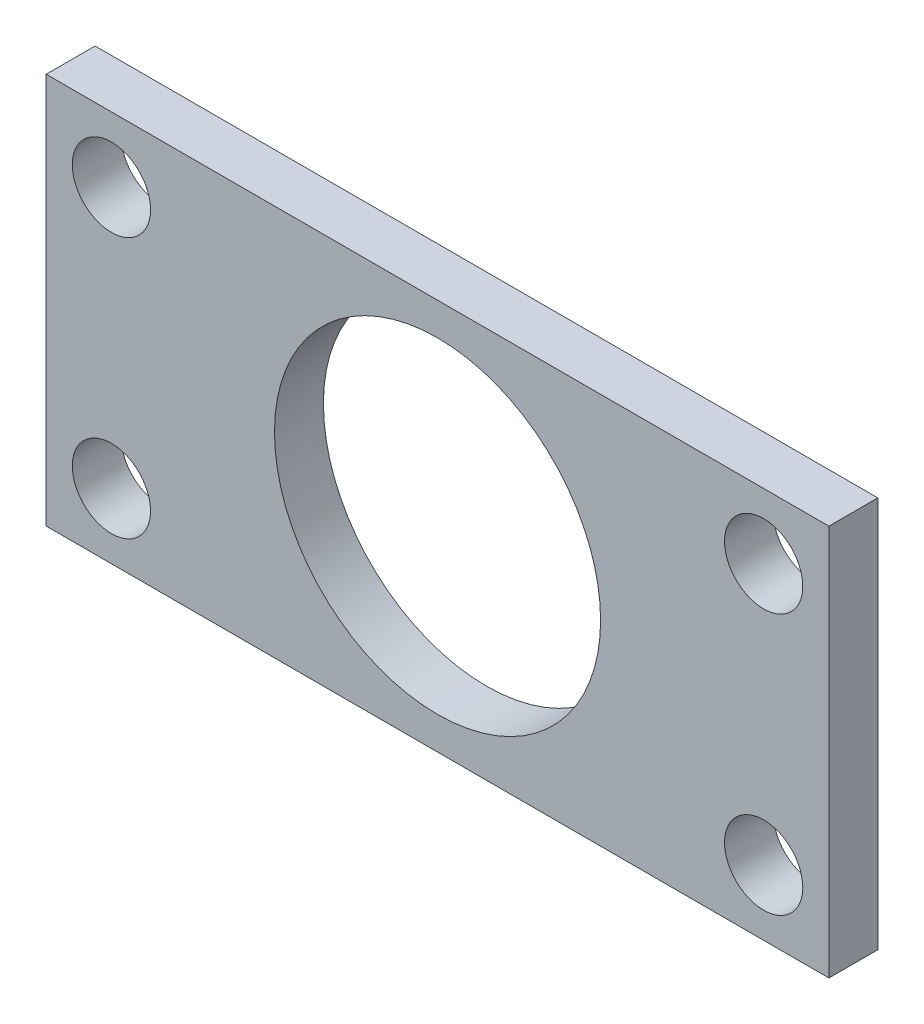
ISO-10303-21;
HEADER;
FILE_DESCRIPTION(('STEP AP214'),'2;1');
FILE_NAME('part.step','',(''),(''),'','','');
FILE_SCHEMA(('AUTOMOTIVE_DESIGN { 1 0 10303 214 1 1 1 1 }'));
ENDSEC;
DATA;
#1=APPLICATION_CONTEXT('core data for automotive mechanical design processes');
#2=APPLICATION_PROTOCOL_DEFINITION('international standard','automotive_design',2000,#1);
#3=PRODUCT_CONTEXT('',#1,'mechanical');
#4=PRODUCT('Part','Part','',(#3));
#5=PRODUCT_RELATED_PRODUCT_CATEGORY('part','',(#4));
#6=PRODUCT_DEFINITION_FORMATION('','',#4);
#7=PRODUCT_DEFINITION_CONTEXT('part definition',#1,'design');
#8=PRODUCT_DEFINITION('design','',#6,#7);
#9=PRODUCT_DEFINITION_SHAPE('','',#8);
#10=(LENGTH_UNIT() NAMED_UNIT(*) SI_UNIT(.MILLI.,.METRE.));
#11=(NAMED_UNIT(*) PLANE_ANGLE_UNIT() SI_UNIT($,.RADIAN.));
#12=(NAMED_UNIT(*) SI_UNIT($,.STERADIAN.) SOLID_ANGLE_UNIT());
#13=UNCERTAINTY_MEASURE_WITH_UNIT(LENGTH_MEASURE(1.E-05),#10,'distance_accuracy_value','');
#14=(GEOMETRIC_REPRESENTATION_CONTEXT(3) GLOBAL_UNCERTAINTY_ASSIGNED_CONTEXT((#13)) GLOBAL_UNIT_ASSIGNED_CONTEXT((#10,
#11,#12)) REPRESENTATION_CONTEXT('',''));
#15=CARTESIAN_POINT('',(0.,0.,0.));
#16=DIRECTION('',(0.,0.,1.));
#17=DIRECTION('',(1.,0.,0.));
#18=AXIS2_PLACEMENT_3D('',#15,#16,#17);
#19=CARTESIAN_POINT('',(0.,0.,1.5));
#20=DIRECTION('',(0.,0.,-1.));
#21=DIRECTION('',(-1.,0.,0.));
#22=AXIS2_PLACEMENT_3D('',#19,#20,#21);
#23=PLANE('',#22);
#24=DIRECTION('',(0.,-1.,0.));
#25=VECTOR('',#24,1.);
#26=CARTESIAN_POINT('',(0.,0.,1.5));
#27=LINE('',#26,#25);
#28=CARTESIAN_POINT('',(0.,12.,1.5));
#29=VERTEX_POINT('',#28);
#30=CARTESIAN_POINT('',(0.,0.,1.5));
#31=VERTEX_POINT('',#30);
#32=EDGE_CURVE('E89',#29,#31,#27,.T.);
#33=ORIENTED_EDGE('',*,*,#32,.T.);
#34=DIRECTION('',(1.,0.,0.));
#35=VECTOR('',#34,1.);
#36=CARTESIAN_POINT('',(0.,0.,1.5));
#37=LINE('',#36,#35);
#38=CARTESIAN_POINT('',(24.,0.,1.5));
#39=VERTEX_POINT('',#38);
#40=EDGE_CURVE('E84',#31,#39,#37,.T.);
#41=ORIENTED_EDGE('',*,*,#40,.T.);
#42=DIRECTION('',(0.,1.,0.));
#43=VECTOR('',#42,1.);
#44=CARTESIAN_POINT('',(24.,0.,1.5));
#45=LINE('',#44,#43);
#46=CARTESIAN_POINT('',(24.,12.,1.5));
#47=VERTEX_POINT('',#46);
#48=EDGE_CURVE('E87',#39,#47,#45,.T.);
#49=ORIENTED_EDGE('',*,*,#48,.T.);
#50=DIRECTION('',(-1.,0.,0.));
#51=VECTOR('',#50,1.);
#52=CARTESIAN_POINT('',(0.,12.,1.5));
#53=LINE('',#52,#51);
#54=EDGE_CURVE('E54',#47,#29,#53,.T.);
#55=ORIENTED_EDGE('',*,*,#54,.T.);
#56=EDGE_LOOP('',(#33,#41,#49,#55));
#57=FACE_BOUND('',#56,.T.);
#58=CARTESIAN_POINT('',(2.,10.,1.5));
#59=DIRECTION('',(0.,0.,1.));
#60=DIRECTION('',(1.,0.,0.));
#61=AXIS2_PLACEMENT_3D('',#58,#59,#60);
#62=CIRCLE('',#61,1.2);
#63=CARTESIAN_POINT('',(3.2,10.,1.5));
#64=VERTEX_POINT('',#63);
#65=EDGE_CURVE('E104',#64,#64,#62,.T.);
#66=ORIENTED_EDGE('',*,*,#65,.F.);
#67=EDGE_LOOP('',(#66));
#68=FACE_BOUND('',#67,.T.);
#69=CARTESIAN_POINT('',(22.,10.,1.5));
#70=DIRECTION('',(0.,0.,1.));
#71=DIRECTION('',(-1.,0.,0.));
#72=AXIS2_PLACEMENT_3D('',#69,#70,#71);
#73=CIRCLE('',#72,1.2);
#74=CARTESIAN_POINT('',(20.8,10.,1.5));
#75=VERTEX_POINT('',#74);
#76=EDGE_CURVE('E119',#75,#75,#73,.T.);
#77=ORIENTED_EDGE('',*,*,#76,.F.);
#78=EDGE_LOOP('',(#77));
#79=FACE_BOUND('',#78,.T.);
#80=CARTESIAN_POINT('',(22.,2.,1.5));
#81=DIRECTION('',(0.,0.,1.));
#82=DIRECTION('',(1.,0.,0.));
#83=AXIS2_PLACEMENT_3D('',#80,#81,#82);
#84=CIRCLE('',#83,1.2);
#85=CARTESIAN_POINT('',(23.2,2.,1.5));
#86=VERTEX_POINT('',#85);
#87=EDGE_CURVE('E125',#86,#86,#84,.T.);
#88=ORIENTED_EDGE('',*,*,#87,.F.);
#89=EDGE_LOOP('',(#88));
#90=FACE_BOUND('',#89,.T.);
#91=CARTESIAN_POINT('',(2.,2.,1.5));
#92=DIRECTION('',(0.,0.,1.));
#93=DIRECTION('',(-1.,0.,0.));
#94=AXIS2_PLACEMENT_3D('',#91,#92,#93);
#95=CIRCLE('',#94,1.2);
#96=CARTESIAN_POINT('',(0.800000000000001,2.,1.5));
#97=VERTEX_POINT('',#96);
#98=EDGE_CURVE('E131',#97,#97,#95,.T.);
#99=ORIENTED_EDGE('',*,*,#98,.F.);
#100=EDGE_LOOP('',(#99));
#101=FACE_BOUND('',#100,.T.);
#102=CARTESIAN_POINT('',(12.,6.,1.5));
#103=DIRECTION('',(0.,0.,1.));
#104=DIRECTION('',(1.,0.,0.));
#105=AXIS2_PLACEMENT_3D('',#102,#103,#104);
#106=CIRCLE('',#105,5.);
#107=CARTESIAN_POINT('',(17.,6.,1.5));
#108=VERTEX_POINT('',#107);
#109=EDGE_CURVE('E137',#108,#108,#106,.T.);
#110=ORIENTED_EDGE('',*,*,#109,.F.);
#111=EDGE_LOOP('',(#110));
#112=FACE_BOUND('',#111,.T.);
#113=ADVANCED_FACE('F37',(#57,#68,#79,#90,#101,#112),#23,.F.);
#114=CARTESIAN_POINT('',(0.,0.,0.));
#115=DIRECTION('',(0.,0.,-1.));
#116=DIRECTION('',(-1.,0.,0.));
#117=AXIS2_PLACEMENT_3D('',#114,#115,#116);
#118=PLANE('',#117);
#119=CARTESIAN_POINT('',(2.,2.,0.));
#120=DIRECTION('',(0.,0.,1.));
#121=DIRECTION('',(-1.,0.,0.));
#122=AXIS2_PLACEMENT_3D('',#119,#120,#121);
#123=CIRCLE('',#122,1.2);
#124=CARTESIAN_POINT('',(0.800000000000001,2.,0.));
#125=VERTEX_POINT('',#124);
#126=EDGE_CURVE('E134',#125,#125,#123,.T.);
#127=ORIENTED_EDGE('',*,*,#126,.T.);
#128=EDGE_LOOP('',(#127));
#129=FACE_BOUND('',#128,.T.);
#130=CARTESIAN_POINT('',(22.,10.,0.));
#131=DIRECTION('',(0.,0.,1.));
#132=DIRECTION('',(-1.,0.,0.));
#133=AXIS2_PLACEMENT_3D('',#130,#131,#132);
#134=CIRCLE('',#133,1.2);
#135=CARTESIAN_POINT('',(20.8,10.,0.));
#136=VERTEX_POINT('',#135);
#137=EDGE_CURVE('E122',#136,#136,#134,.T.);
#138=ORIENTED_EDGE('',*,*,#137,.T.);
#139=EDGE_LOOP('',(#138));
#140=FACE_BOUND('',#139,.T.);
#141=DIRECTION('',(0.,-1.,0.));
#142=VECTOR('',#141,1.);
#143=CARTESIAN_POINT('',(0.,0.,0.));
#144=LINE('',#143,#142);
#145=CARTESIAN_POINT('',(0.,12.,0.));
#146=VERTEX_POINT('',#145);
#147=CARTESIAN_POINT('',(0.,0.,0.));
#148=VERTEX_POINT('',#147);
#149=EDGE_CURVE('E101',#146,#148,#144,.T.);
#150=ORIENTED_EDGE('',*,*,#149,.F.);
#151=DIRECTION('',(-1.,0.,0.));
#152=VECTOR('',#151,1.);
#153=CARTESIAN_POINT('',(0.,12.,0.));
#154=LINE('',#153,#152);
#155=CARTESIAN_POINT('',(24.,12.,0.));
#156=VERTEX_POINT('',#155);
#157=EDGE_CURVE('E77',#156,#146,#154,.T.);
#158=ORIENTED_EDGE('',*,*,#157,.F.);
#159=DIRECTION('',(0.,1.,0.));
#160=VECTOR('',#159,1.);
#161=CARTESIAN_POINT('',(24.,0.,0.));
#162=LINE('',#161,#160);
#163=CARTESIAN_POINT('',(24.,0.,0.));
#164=VERTEX_POINT('',#163);
#165=EDGE_CURVE('E71',#164,#156,#162,.T.);
#166=ORIENTED_EDGE('',*,*,#165,.F.);
#167=DIRECTION('',(1.,0.,0.));
#168=VECTOR('',#167,1.);
#169=CARTESIAN_POINT('',(0.,0.,0.));
#170=LINE('',#169,#168);
#171=EDGE_CURVE('E93',#148,#164,#170,.T.);
#172=ORIENTED_EDGE('',*,*,#171,.F.);
#173=EDGE_LOOP('',(#150,#158,#166,#172));
#174=FACE_BOUND('',#173,.T.);
#175=CARTESIAN_POINT('',(2.,10.,0.));
#176=DIRECTION('',(0.,0.,1.));
#177=DIRECTION('',(1.,0.,0.));
#178=AXIS2_PLACEMENT_3D('',#175,#176,#177);
#179=CIRCLE('',#178,1.2);
#180=CARTESIAN_POINT('',(3.2,10.,0.));
#181=VERTEX_POINT('',#180);
#182=EDGE_CURVE('E116',#181,#181,#179,.T.);
#183=ORIENTED_EDGE('',*,*,#182,.T.);
#184=EDGE_LOOP('',(#183));
#185=FACE_BOUND('',#184,.T.);
#186=CARTESIAN_POINT('',(22.,2.,0.));
#187=DIRECTION('',(0.,0.,1.));
#188=DIRECTION('',(1.,0.,0.));
#189=AXIS2_PLACEMENT_3D('',#186,#187,#188);
#190=CIRCLE('',#189,1.2);
#191=CARTESIAN_POINT('',(23.2,2.,0.));
#192=VERTEX_POINT('',#191);
#193=EDGE_CURVE('E128',#192,#192,#190,.T.);
#194=ORIENTED_EDGE('',*,*,#193,.T.);
#195=EDGE_LOOP('',(#194));
#196=FACE_BOUND('',#195,.T.);
#197=CARTESIAN_POINT('',(12.,6.,0.));
#198=DIRECTION('',(0.,0.,1.));
#199=DIRECTION('',(1.,0.,0.));
#200=AXIS2_PLACEMENT_3D('',#197,#198,#199);
#201=CIRCLE('',#200,5.);
#202=CARTESIAN_POINT('',(17.,6.,0.));
#203=VERTEX_POINT('',#202);
#204=EDGE_CURVE('E140',#203,#203,#201,.T.);
#205=ORIENTED_EDGE('',*,*,#204,.T.);
#206=EDGE_LOOP('',(#205));
#207=FACE_BOUND('',#206,.T.);
#208=ADVANCED_FACE('F112',(#129,#140,#174,#185,#196,#207),#118,.T.);
#209=CARTESIAN_POINT('',(0.,0.,1.5));
#210=DIRECTION('',(1.,0.,0.));
#211=DIRECTION('',(0.,0.,-1.));
#212=AXIS2_PLACEMENT_3D('',#209,#210,#211);
#213=PLANE('',#212);
#214=ORIENTED_EDGE('',*,*,#149,.T.);
#215=DIRECTION('',(0.,0.,-1.));
#216=VECTOR('',#215,1.);
#217=CARTESIAN_POINT('',(0.,0.,1.5));
#218=LINE('',#217,#216);
#219=EDGE_CURVE('E11',#31,#148,#218,.T.);
#220=ORIENTED_EDGE('',*,*,#219,.F.);
#221=ORIENTED_EDGE('',*,*,#32,.F.);
#222=DIRECTION('',(0.,0.,-1.));
#223=VECTOR('',#222,1.);
#224=CARTESIAN_POINT('',(0.,12.,1.5));
#225=LINE('',#224,#223);
#226=EDGE_CURVE('E97',#29,#146,#225,.T.);
#227=ORIENTED_EDGE('',*,*,#226,.T.);
#228=EDGE_LOOP('',(#214,#220,#221,#227));
#229=FACE_BOUND('',#228,.T.);
#230=ADVANCED_FACE('F39',(#229),#213,.F.);
#231=CARTESIAN_POINT('',(0.,0.,1.5));
#232=DIRECTION('',(0.,1.,0.));
#233=DIRECTION('',(0.,0.,1.));
#234=AXIS2_PLACEMENT_3D('',#231,#232,#233);
#235=PLANE('',#234);
#236=ORIENTED_EDGE('',*,*,#171,.T.);
#237=DIRECTION('',(0.,0.,-1.));
#238=VECTOR('',#237,1.);
#239=CARTESIAN_POINT('',(24.,0.,1.5));
#240=LINE('',#239,#238);
#241=EDGE_CURVE('E46',#39,#164,#240,.T.);
#242=ORIENTED_EDGE('',*,*,#241,.F.);
#243=ORIENTED_EDGE('',*,*,#40,.F.);
#244=ORIENTED_EDGE('',*,*,#219,.T.);
#245=EDGE_LOOP('',(#236,#242,#243,#244));
#246=FACE_BOUND('',#245,.T.);
#247=ADVANCED_FACE('F92',(#246),#235,.F.);
#248=CARTESIAN_POINT('',(24.,0.,1.5));
#249=DIRECTION('',(-1.,0.,0.));
#250=DIRECTION('',(0.,0.,1.));
#251=AXIS2_PLACEMENT_3D('',#248,#249,#250);
#252=PLANE('',#251);
#253=ORIENTED_EDGE('',*,*,#165,.T.);
#254=DIRECTION('',(0.,0.,-1.));
#255=VECTOR('',#254,1.);
#256=CARTESIAN_POINT('',(24.,12.,1.5));
#257=LINE('',#256,#255);
#258=EDGE_CURVE('E94',#47,#156,#257,.T.);
#259=ORIENTED_EDGE('',*,*,#258,.F.);
#260=ORIENTED_EDGE('',*,*,#48,.F.);
#261=ORIENTED_EDGE('',*,*,#241,.T.);
#262=EDGE_LOOP('',(#253,#259,#260,#261));
#263=FACE_BOUND('',#262,.T.);
#264=ADVANCED_FACE('F95',(#263),#252,.F.);
#265=CARTESIAN_POINT('',(0.,12.,1.5));
#266=DIRECTION('',(0.,-1.,0.));
#267=DIRECTION('',(0.,0.,-1.));
#268=AXIS2_PLACEMENT_3D('',#265,#266,#267);
#269=PLANE('',#268);
#270=ORIENTED_EDGE('',*,*,#157,.T.);
#271=ORIENTED_EDGE('',*,*,#226,.F.);
#272=ORIENTED_EDGE('',*,*,#54,.F.);
#273=ORIENTED_EDGE('',*,*,#258,.T.);
#274=EDGE_LOOP('',(#270,#271,#272,#273));
#275=FACE_BOUND('',#274,.T.);
#276=ADVANCED_FACE('F109',(#275),#269,.F.);
#277=CARTESIAN_POINT('',(2.,10.,1.5));
#278=DIRECTION('',(0.,0.,-1.));
#279=DIRECTION('',(-1.,0.,0.));
#280=AXIS2_PLACEMENT_3D('',#277,#278,#279);
#281=CYLINDRICAL_SURFACE('',#280,1.2);
#282=ORIENTED_EDGE('',*,*,#65,.T.);
#283=EDGE_LOOP('',(#282));
#284=FACE_BOUND('',#283,.T.);
#285=ORIENTED_EDGE('',*,*,#182,.F.);
#286=EDGE_LOOP('',(#285));
#287=FACE_BOUND('',#286,.T.);
#288=ADVANCED_FACE('F157',(#284,#287),#281,.F.);
#289=CARTESIAN_POINT('',(22.,10.,1.5));
#290=DIRECTION('',(0.,0.,-1.));
#291=DIRECTION('',(-1.,0.,0.));
#292=AXIS2_PLACEMENT_3D('',#289,#290,#291);
#293=CYLINDRICAL_SURFACE('',#292,1.2);
#294=ORIENTED_EDGE('',*,*,#76,.T.);
#295=EDGE_LOOP('',(#294));
#296=FACE_BOUND('',#295,.T.);
#297=ORIENTED_EDGE('',*,*,#137,.F.);
#298=EDGE_LOOP('',(#297));
#299=FACE_BOUND('',#298,.T.);
#300=ADVANCED_FACE('F203',(#296,#299),#293,.F.);
#301=CARTESIAN_POINT('',(22.,2.,1.5));
#302=DIRECTION('',(0.,0.,-1.));
#303=DIRECTION('',(-1.,0.,0.));
#304=AXIS2_PLACEMENT_3D('',#301,#302,#303);
#305=CYLINDRICAL_SURFACE('',#304,1.2);
#306=ORIENTED_EDGE('',*,*,#87,.T.);
#307=EDGE_LOOP('',(#306));
#308=FACE_BOUND('',#307,.T.);
#309=ORIENTED_EDGE('',*,*,#193,.F.);
#310=EDGE_LOOP('',(#309));
#311=FACE_BOUND('',#310,.T.);
#312=ADVANCED_FACE('F211',(#308,#311),#305,.F.);
#313=CARTESIAN_POINT('',(2.,2.,1.5));
#314=DIRECTION('',(0.,0.,-1.));
#315=DIRECTION('',(-1.,0.,0.));
#316=AXIS2_PLACEMENT_3D('',#313,#314,#315);
#317=CYLINDRICAL_SURFACE('',#316,1.2);
#318=ORIENTED_EDGE('',*,*,#98,.T.);
#319=EDGE_LOOP('',(#318));
#320=FACE_BOUND('',#319,.T.);
#321=ORIENTED_EDGE('',*,*,#126,.F.);
#322=EDGE_LOOP('',(#321));
#323=FACE_BOUND('',#322,.T.);
#324=ADVANCED_FACE('F219',(#320,#323),#317,.F.);
#325=CARTESIAN_POINT('',(12.,6.,1.5));
#326=DIRECTION('',(0.,0.,-1.));
#327=DIRECTION('',(-1.,0.,0.));
#328=AXIS2_PLACEMENT_3D('',#325,#326,#327);
#329=CYLINDRICAL_SURFACE('',#328,5.);
#330=ORIENTED_EDGE('',*,*,#109,.T.);
#331=EDGE_LOOP('',(#330));
#332=FACE_BOUND('',#331,.T.);
#333=ORIENTED_EDGE('',*,*,#204,.F.);
#334=EDGE_LOOP('',(#333));
#335=FACE_BOUND('',#334,.T.);
#336=ADVANCED_FACE('F146',(#332,#335),#329,.F.);
#337=CLOSED_SHELL('',(#113,#208,#230,#247,#264,#276,#288,#300,#312,#324,#336));
#338=MANIFOLD_SOLID_BREP('B2',#337);
#339=ADVANCED_BREP_SHAPE_REPRESENTATION('',(#18,#338),#14);
#340=SHAPE_DEFINITION_REPRESENTATION(#9,#339);
ENDSEC;
END-ISO-10303-21;
